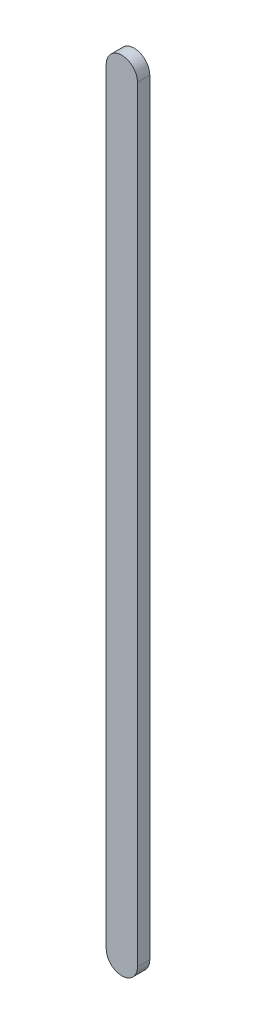
ISO-10303-21;
HEADER;
FILE_DESCRIPTION(('STEP AP214'),'2;1');
FILE_NAME('part.step','',(''),(''),'','','');
FILE_SCHEMA(('AUTOMOTIVE_DESIGN { 1 0 10303 214 1 1 1 1 }'));
ENDSEC;
DATA;
#1=APPLICATION_CONTEXT('core data for automotive mechanical design processes');
#2=APPLICATION_PROTOCOL_DEFINITION('international standard','automotive_design',2000,#1);
#3=PRODUCT_CONTEXT('',#1,'mechanical');
#4=PRODUCT('Part','Part','',(#3));
#5=PRODUCT_RELATED_PRODUCT_CATEGORY('part','',(#4));
#6=PRODUCT_DEFINITION_FORMATION('','',#4);
#7=PRODUCT_DEFINITION_CONTEXT('part definition',#1,'design');
#8=PRODUCT_DEFINITION('design','',#6,#7);
#9=PRODUCT_DEFINITION_SHAPE('','',#8);
#10=(LENGTH_UNIT() NAMED_UNIT(*) SI_UNIT(.MILLI.,.METRE.));
#11=(NAMED_UNIT(*) PLANE_ANGLE_UNIT() SI_UNIT($,.RADIAN.));
#12=(NAMED_UNIT(*) SI_UNIT($,.STERADIAN.) SOLID_ANGLE_UNIT());
#13=UNCERTAINTY_MEASURE_WITH_UNIT(LENGTH_MEASURE(1.E-05),#10,'distance_accuracy_value','');
#14=(GEOMETRIC_REPRESENTATION_CONTEXT(3) GLOBAL_UNCERTAINTY_ASSIGNED_CONTEXT((#13)) GLOBAL_UNIT_ASSIGNED_CONTEXT((#10,
#11,#12)) REPRESENTATION_CONTEXT('',''));
#15=CARTESIAN_POINT('',(0.,0.,0.));
#16=DIRECTION('',(0.,0.,1.));
#17=DIRECTION('',(1.,0.,0.));
#18=AXIS2_PLACEMENT_3D('',#15,#16,#17);
#19=CARTESIAN_POINT('',(88.519,79.883,0.));
#20=DIRECTION('',(-1.,0.,0.));
#21=DIRECTION('',(0.,1.,0.));
#22=AXIS2_PLACEMENT_3D('',#19,#20,#21);
#23=PLANE('',#22);
#24=DIRECTION('',(0.,1.,0.));
#25=VECTOR('',#24,1.);
#26=CARTESIAN_POINT('',(88.519,79.883,0.1999996));
#27=LINE('',#26,#25);
#28=CARTESIAN_POINT('',(88.519,79.883,0.1999996));
#29=VERTEX_POINT('',#28);
#30=CARTESIAN_POINT('',(88.519,92.329,0.1999996));
#31=VERTEX_POINT('',#30);
#32=EDGE_CURVE('E11',#29,#31,#27,.T.);
#33=ORIENTED_EDGE('',*,*,#32,.F.);
#34=DIRECTION('',(0.,0.,1.));
#35=VECTOR('',#34,1.);
#36=CARTESIAN_POINT('',(88.519,79.883,0.));
#37=LINE('',#36,#35);
#38=CARTESIAN_POINT('',(88.519,79.883,0.));
#39=VERTEX_POINT('',#38);
#40=EDGE_CURVE('E24',#39,#29,#37,.T.);
#41=ORIENTED_EDGE('',*,*,#40,.F.);
#42=DIRECTION('',(0.,1.,0.));
#43=VECTOR('',#42,1.);
#44=CARTESIAN_POINT('',(88.519,79.883,0.));
#45=LINE('',#44,#43);
#46=CARTESIAN_POINT('',(88.519,92.329,0.));
#47=VERTEX_POINT('',#46);
#48=EDGE_CURVE('E75',#39,#47,#45,.T.);
#49=ORIENTED_EDGE('',*,*,#48,.T.);
#50=DIRECTION('',(0.,0.,1.));
#51=VECTOR('',#50,1.);
#52=CARTESIAN_POINT('',(88.519,92.329,0.));
#53=LINE('',#52,#51);
#54=EDGE_CURVE('E37',#47,#31,#53,.T.);
#55=ORIENTED_EDGE('',*,*,#54,.T.);
#56=EDGE_LOOP('',(#33,#41,#49,#55));
#57=FACE_BOUND('',#56,.T.);
#58=ADVANCED_FACE('F17',(#57),#23,.F.);
#59=CARTESIAN_POINT('',(88.265,92.329,0.));
#60=DIRECTION('',(0.,0.,-1.));
#61=DIRECTION('',(1.,0.,0.));
#62=AXIS2_PLACEMENT_3D('',#59,#60,#61);
#63=CYLINDRICAL_SURFACE('',#62,0.254000000000005);
#64=CARTESIAN_POINT('',(88.265,92.329,0.1999996));
#65=DIRECTION('',(0.,0.,1.));
#66=DIRECTION('',(1.,0.,0.));
#67=AXIS2_PLACEMENT_3D('',#64,#65,#66);
#68=CIRCLE('',#67,0.254000000000005);
#69=CARTESIAN_POINT('',(88.011,92.329,0.1999996));
#70=VERTEX_POINT('',#69);
#71=EDGE_CURVE('E83',#31,#70,#68,.T.);
#72=ORIENTED_EDGE('',*,*,#71,.F.);
#73=ORIENTED_EDGE('',*,*,#54,.F.);
#74=CARTESIAN_POINT('',(88.265,92.329,0.));
#75=DIRECTION('',(0.,0.,1.));
#76=DIRECTION('',(1.,0.,0.));
#77=AXIS2_PLACEMENT_3D('',#74,#75,#76);
#78=CIRCLE('',#77,0.254000000000005);
#79=CARTESIAN_POINT('',(88.011,92.329,0.));
#80=VERTEX_POINT('',#79);
#81=EDGE_CURVE('E81',#47,#80,#78,.T.);
#82=ORIENTED_EDGE('',*,*,#81,.T.);
#83=DIRECTION('',(0.,0.,1.));
#84=VECTOR('',#83,1.);
#85=CARTESIAN_POINT('',(88.011,92.329,0.));
#86=LINE('',#85,#84);
#87=EDGE_CURVE('E67',#80,#70,#86,.T.);
#88=ORIENTED_EDGE('',*,*,#87,.T.);
#89=EDGE_LOOP('',(#72,#73,#82,#88));
#90=FACE_BOUND('',#89,.T.);
#91=ADVANCED_FACE('F89',(#90),#63,.T.);
#92=CARTESIAN_POINT('',(88.011,92.329,0.));
#93=DIRECTION('',(1.,0.,0.));
#94=DIRECTION('',(0.,-1.,0.));
#95=AXIS2_PLACEMENT_3D('',#92,#93,#94);
#96=PLANE('',#95);
#97=DIRECTION('',(0.,-1.,0.));
#98=VECTOR('',#97,1.);
#99=CARTESIAN_POINT('',(88.011,92.329,0.1999996));
#100=LINE('',#99,#98);
#101=CARTESIAN_POINT('',(88.011,79.883,0.1999996));
#102=VERTEX_POINT('',#101);
#103=EDGE_CURVE('E71',#70,#102,#100,.T.);
#104=ORIENTED_EDGE('',*,*,#103,.F.);
#105=ORIENTED_EDGE('',*,*,#87,.F.);
#106=DIRECTION('',(0.,-1.,0.));
#107=VECTOR('',#106,1.);
#108=CARTESIAN_POINT('',(88.011,92.329,0.));
#109=LINE('',#108,#107);
#110=CARTESIAN_POINT('',(88.011,79.883,0.));
#111=VERTEX_POINT('',#110);
#112=EDGE_CURVE('E63',#80,#111,#109,.T.);
#113=ORIENTED_EDGE('',*,*,#112,.T.);
#114=DIRECTION('',(0.,0.,1.));
#115=VECTOR('',#114,1.);
#116=CARTESIAN_POINT('',(88.011,79.883,0.));
#117=LINE('',#116,#115);
#118=EDGE_CURVE('E53',#111,#102,#117,.T.);
#119=ORIENTED_EDGE('',*,*,#118,.T.);
#120=EDGE_LOOP('',(#104,#105,#113,#119));
#121=FACE_BOUND('',#120,.T.);
#122=ADVANCED_FACE('F66',(#121),#96,.F.);
#123=CARTESIAN_POINT('',(88.265,79.883,0.));
#124=DIRECTION('',(0.,0.,-1.));
#125=DIRECTION('',(-1.,0.,0.));
#126=AXIS2_PLACEMENT_3D('',#123,#124,#125);
#127=CYLINDRICAL_SURFACE('',#126,0.254000000000005);
#128=CARTESIAN_POINT('',(88.265,79.883,0.1999996));
#129=DIRECTION('',(0.,0.,1.));
#130=DIRECTION('',(-1.,0.,0.));
#131=AXIS2_PLACEMENT_3D('',#128,#129,#130);
#132=CIRCLE('',#131,0.254000000000005);
#133=EDGE_CURVE('E59',#102,#29,#132,.T.);
#134=ORIENTED_EDGE('',*,*,#133,.F.);
#135=ORIENTED_EDGE('',*,*,#118,.F.);
#136=CARTESIAN_POINT('',(88.265,79.883,0.));
#137=DIRECTION('',(0.,0.,1.));
#138=DIRECTION('',(-1.,0.,0.));
#139=AXIS2_PLACEMENT_3D('',#136,#137,#138);
#140=CIRCLE('',#139,0.254000000000005);
#141=EDGE_CURVE('E57',#111,#39,#140,.T.);
#142=ORIENTED_EDGE('',*,*,#141,.T.);
#143=ORIENTED_EDGE('',*,*,#40,.T.);
#144=EDGE_LOOP('',(#134,#135,#142,#143));
#145=FACE_BOUND('',#144,.T.);
#146=ADVANCED_FACE('F55',(#145),#127,.T.);
#147=CARTESIAN_POINT('',(88.519,79.883,0.));
#148=DIRECTION('',(0.,0.,-1.));
#149=DIRECTION('',(-1.,0.,0.));
#150=AXIS2_PLACEMENT_3D('',#147,#148,#149);
#151=PLANE('',#150);
#152=ORIENTED_EDGE('',*,*,#141,.F.);
#153=ORIENTED_EDGE('',*,*,#112,.F.);
#154=ORIENTED_EDGE('',*,*,#81,.F.);
#155=ORIENTED_EDGE('',*,*,#48,.F.);
#156=EDGE_LOOP('',(#152,#153,#154,#155));
#157=FACE_BOUND('',#156,.T.);
#158=ADVANCED_FACE('F74',(#157),#151,.T.);
#159=CARTESIAN_POINT('',(88.519,79.883,0.1999996));
#160=DIRECTION('',(0.,0.,-1.));
#161=DIRECTION('',(-1.,0.,0.));
#162=AXIS2_PLACEMENT_3D('',#159,#160,#161);
#163=PLANE('',#162);
#164=ORIENTED_EDGE('',*,*,#32,.T.);
#165=ORIENTED_EDGE('',*,*,#71,.T.);
#166=ORIENTED_EDGE('',*,*,#103,.T.);
#167=ORIENTED_EDGE('',*,*,#133,.T.);
#168=EDGE_LOOP('',(#164,#165,#166,#167));
#169=FACE_BOUND('',#168,.T.);
#170=ADVANCED_FACE('F91',(#169),#163,.F.);
#171=CLOSED_SHELL('',(#58,#91,#122,#146,#158,#170));
#172=MANIFOLD_SOLID_BREP('B1',#171);
#173=ADVANCED_BREP_SHAPE_REPRESENTATION('',(#18,#172),#14);
#174=SHAPE_DEFINITION_REPRESENTATION(#9,#173);
ENDSEC;
END-ISO-10303-21;
